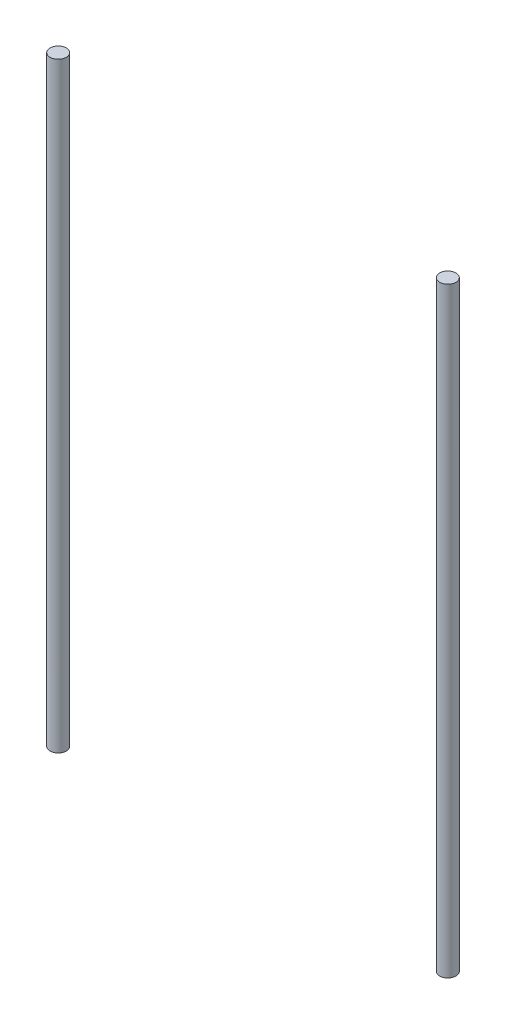
ISO-10303-21;
HEADER;
FILE_DESCRIPTION(('STEP AP214'),'2;1');
FILE_NAME('part.step','',(''),(''),'','','');
FILE_SCHEMA(('AUTOMOTIVE_DESIGN { 1 0 10303 214 1 1 1 1 }'));
ENDSEC;
DATA;
#1=APPLICATION_CONTEXT('core data for automotive mechanical design processes');
#2=APPLICATION_PROTOCOL_DEFINITION('international standard','automotive_design',2000,#1);
#3=PRODUCT_CONTEXT('',#1,'mechanical');
#4=PRODUCT('Part','Part','',(#3));
#5=PRODUCT_RELATED_PRODUCT_CATEGORY('part','',(#4));
#6=PRODUCT_DEFINITION_FORMATION('','',#4);
#7=PRODUCT_DEFINITION_CONTEXT('part definition',#1,'design');
#8=PRODUCT_DEFINITION('design','',#6,#7);
#9=PRODUCT_DEFINITION_SHAPE('','',#8);
#10=(LENGTH_UNIT() NAMED_UNIT(*) SI_UNIT(.MILLI.,.METRE.));
#11=(NAMED_UNIT(*) PLANE_ANGLE_UNIT() SI_UNIT($,.RADIAN.));
#12=(NAMED_UNIT(*) SI_UNIT($,.STERADIAN.) SOLID_ANGLE_UNIT());
#13=UNCERTAINTY_MEASURE_WITH_UNIT(LENGTH_MEASURE(1.E-05),#10,'distance_accuracy_value','');
#14=(GEOMETRIC_REPRESENTATION_CONTEXT(3) GLOBAL_UNCERTAINTY_ASSIGNED_CONTEXT((#13)) GLOBAL_UNIT_ASSIGNED_CONTEXT((#10,
#11,#12)) REPRESENTATION_CONTEXT('',''));
#15=CARTESIAN_POINT('',(0.,0.,0.));
#16=DIRECTION('',(0.,0.,1.));
#17=DIRECTION('',(1.,0.,0.));
#18=AXIS2_PLACEMENT_3D('',#15,#16,#17);
#19=CARTESIAN_POINT('',(-304.8,505.921024484277,12.7));
#20=DIRECTION('',(0.,-1.,0.));
#21=DIRECTION('',(0.,0.,-1.));
#22=AXIS2_PLACEMENT_3D('',#19,#20,#21);
#23=CYLINDRICAL_SURFACE('',#22,12.7);
#24=CARTESIAN_POINT('',(-304.8,470.,12.7));
#25=DIRECTION('',(0.,1.,0.));
#26=DIRECTION('',(0.,0.,-1.));
#27=AXIS2_PLACEMENT_3D('',#24,#25,#26);
#28=CIRCLE('',#27,12.7);
#29=CARTESIAN_POINT('',(-304.8,470.,0.));
#30=VERTEX_POINT('',#29);
#31=EDGE_CURVE('E11',#30,#30,#28,.T.);
#32=ORIENTED_EDGE('',*,*,#31,.F.);
#33=EDGE_LOOP('',(#32));
#34=FACE_BOUND('',#33,.T.);
#35=CARTESIAN_POINT('',(-304.8,-470.,12.7));
#36=DIRECTION('',(0.,-1.,0.));
#37=DIRECTION('',(0.,0.,1.));
#38=AXIS2_PLACEMENT_3D('',#35,#36,#37);
#39=CIRCLE('',#38,12.7);
#40=CARTESIAN_POINT('',(-304.8,-470.,25.4));
#41=VERTEX_POINT('',#40);
#42=EDGE_CURVE('E45',#41,#41,#39,.F.);
#43=ORIENTED_EDGE('',*,*,#42,.T.);
#44=EDGE_LOOP('',(#43));
#45=FACE_BOUND('',#44,.T.);
#46=ADVANCED_FACE('F39',(#34,#45),#23,.T.);
#47=CARTESIAN_POINT('',(287.5,470.,12.));
#48=DIRECTION('',(0.,-1.,0.));
#49=DIRECTION('',(0.,0.,-1.));
#50=AXIS2_PLACEMENT_3D('',#47,#48,#49);
#51=PLANE('',#50);
#52=ORIENTED_EDGE('',*,*,#31,.T.);
#53=EDGE_LOOP('',(#52));
#54=FACE_BOUND('',#53,.T.);
#55=ADVANCED_FACE('F54',(#54),#51,.F.);
#56=CARTESIAN_POINT('',(287.5,-470.,12.));
#57=DIRECTION('',(0.,1.,0.));
#58=DIRECTION('',(0.,0.,1.));
#59=AXIS2_PLACEMENT_3D('',#56,#57,#58);
#60=PLANE('',#59);
#61=ORIENTED_EDGE('',*,*,#42,.F.);
#62=EDGE_LOOP('',(#61));
#63=FACE_BOUND('',#62,.T.);
#64=ADVANCED_FACE('F52',(#63),#60,.F.);
#65=CLOSED_SHELL('',(#46,#55,#64));
#66=MANIFOLD_SOLID_BREP('B2',#65);
#67=CARTESIAN_POINT('',(304.8,505.921024484277,12.7));
#68=DIRECTION('',(0.,-1.,0.));
#69=DIRECTION('',(0.,0.,-1.));
#70=AXIS2_PLACEMENT_3D('',#67,#68,#69);
#71=CYLINDRICAL_SURFACE('',#70,12.7);
#72=CARTESIAN_POINT('',(304.8,470.,12.7));
#73=DIRECTION('',(0.,-1.,0.));
#74=DIRECTION('',(0.,0.,-1.));
#75=AXIS2_PLACEMENT_3D('',#72,#73,#74);
#76=CIRCLE('',#75,12.7);
#77=CARTESIAN_POINT('',(304.8,470.,0.));
#78=VERTEX_POINT('',#77);
#79=EDGE_CURVE('E38',#78,#78,#76,.T.);
#80=ORIENTED_EDGE('',*,*,#79,.T.);
#81=EDGE_LOOP('',(#80));
#82=FACE_BOUND('',#81,.T.);
#83=CARTESIAN_POINT('',(304.8,-470.,12.7));
#84=DIRECTION('',(0.,1.,0.));
#85=DIRECTION('',(0.,0.,1.));
#86=AXIS2_PLACEMENT_3D('',#83,#84,#85);
#87=CIRCLE('',#86,12.7);
#88=CARTESIAN_POINT('',(304.8,-470.,25.4));
#89=VERTEX_POINT('',#88);
#90=EDGE_CURVE('E86',#89,#89,#87,.F.);
#91=ORIENTED_EDGE('',*,*,#90,.F.);
#92=EDGE_LOOP('',(#91));
#93=FACE_BOUND('',#92,.T.);
#94=ADVANCED_FACE('F80',(#82,#93),#71,.T.);
#95=CARTESIAN_POINT('',(-287.5,470.,12.));
#96=DIRECTION('',(0.,-1.,0.));
#97=DIRECTION('',(0.,0.,-1.));
#98=AXIS2_PLACEMENT_3D('',#95,#96,#97);
#99=PLANE('',#98);
#100=ORIENTED_EDGE('',*,*,#79,.F.);
#101=EDGE_LOOP('',(#100));
#102=FACE_BOUND('',#101,.T.);
#103=ADVANCED_FACE('F95',(#102),#99,.F.);
#104=CARTESIAN_POINT('',(-287.5,-470.,12.));
#105=DIRECTION('',(0.,1.,0.));
#106=DIRECTION('',(0.,0.,1.));
#107=AXIS2_PLACEMENT_3D('',#104,#105,#106);
#108=PLANE('',#107);
#109=ORIENTED_EDGE('',*,*,#90,.T.);
#110=EDGE_LOOP('',(#109));
#111=FACE_BOUND('',#110,.T.);
#112=ADVANCED_FACE('F92',(#111),#108,.F.);
#113=CLOSED_SHELL('',(#94,#103,#112));
#114=MANIFOLD_SOLID_BREP('B6',#113);
#115=ADVANCED_BREP_SHAPE_REPRESENTATION('',(#18,#66,#114),#14);
#116=SHAPE_DEFINITION_REPRESENTATION(#9,#115);
ENDSEC;
END-ISO-10303-21;
